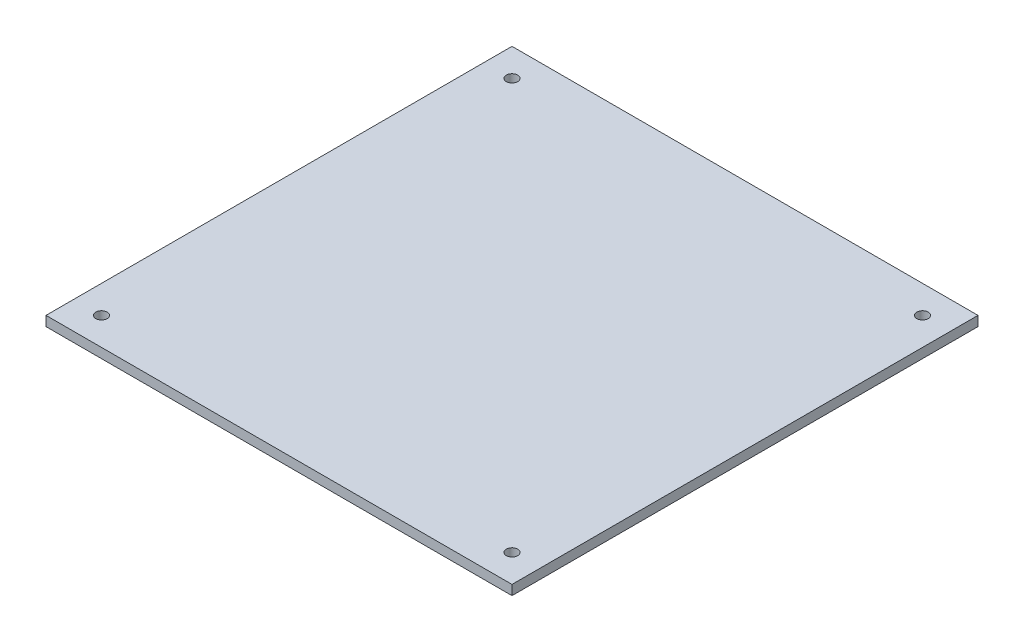
ISO-10303-21;
HEADER;
FILE_DESCRIPTION(('STEP AP214'),'2;1');
FILE_NAME('part.step','',(''),(''),'','','');
FILE_SCHEMA(('AUTOMOTIVE_DESIGN { 1 0 10303 214 1 1 1 1 }'));
ENDSEC;
DATA;
#1=APPLICATION_CONTEXT('core data for automotive mechanical design processes');
#2=APPLICATION_PROTOCOL_DEFINITION('international standard','automotive_design',2000,#1);
#3=PRODUCT_CONTEXT('',#1,'mechanical');
#4=PRODUCT('Part','Part','',(#3));
#5=PRODUCT_RELATED_PRODUCT_CATEGORY('part','',(#4));
#6=PRODUCT_DEFINITION_FORMATION('','',#4);
#7=PRODUCT_DEFINITION_CONTEXT('part definition',#1,'design');
#8=PRODUCT_DEFINITION('design','',#6,#7);
#9=PRODUCT_DEFINITION_SHAPE('','',#8);
#10=(LENGTH_UNIT() NAMED_UNIT(*) SI_UNIT(.MILLI.,.METRE.));
#11=(NAMED_UNIT(*) PLANE_ANGLE_UNIT() SI_UNIT($,.RADIAN.));
#12=(NAMED_UNIT(*) SI_UNIT($,.STERADIAN.) SOLID_ANGLE_UNIT());
#13=UNCERTAINTY_MEASURE_WITH_UNIT(LENGTH_MEASURE(1.E-05),#10,'distance_accuracy_value','');
#14=(GEOMETRIC_REPRESENTATION_CONTEXT(3) GLOBAL_UNCERTAINTY_ASSIGNED_CONTEXT((#13)) GLOBAL_UNIT_ASSIGNED_CONTEXT((#10,
#11,#12)) REPRESENTATION_CONTEXT('',''));
#15=CARTESIAN_POINT('',(0.,0.,0.));
#16=DIRECTION('',(0.,0.,1.));
#17=DIRECTION('',(1.,0.,0.));
#18=AXIS2_PLACEMENT_3D('',#15,#16,#17);
#19=CARTESIAN_POINT('',(0.,5.588,0.));
#20=DIRECTION('',(0.,-1.,0.));
#21=DIRECTION('',(0.,0.,-1.));
#22=AXIS2_PLACEMENT_3D('',#19,#20,#21);
#23=PLANE('',#22);
#24=DIRECTION('',(0.,0.,1.));
#25=VECTOR('',#24,1.);
#26=CARTESIAN_POINT('',(0.,5.588,0.));
#27=LINE('',#26,#25);
#28=CARTESIAN_POINT('',(0.,5.588,-266.7));
#29=VERTEX_POINT('',#28);
#30=CARTESIAN_POINT('',(0.,5.588,0.));
#31=VERTEX_POINT('',#30);
#32=EDGE_CURVE('E85',#29,#31,#27,.T.);
#33=ORIENTED_EDGE('',*,*,#32,.T.);
#34=DIRECTION('',(1.,0.,0.));
#35=VECTOR('',#34,1.);
#36=CARTESIAN_POINT('',(0.,5.588,0.));
#37=LINE('',#36,#35);
#38=CARTESIAN_POINT('',(266.7,5.588,0.));
#39=VERTEX_POINT('',#38);
#40=EDGE_CURVE('E80',#31,#39,#37,.T.);
#41=ORIENTED_EDGE('',*,*,#40,.T.);
#42=DIRECTION('',(0.,0.,-1.));
#43=VECTOR('',#42,1.);
#44=CARTESIAN_POINT('',(266.7,5.588,0.));
#45=LINE('',#44,#43);
#46=CARTESIAN_POINT('',(266.7,5.588,-266.7));
#47=VERTEX_POINT('',#46);
#48=EDGE_CURVE('E83',#39,#47,#45,.T.);
#49=ORIENTED_EDGE('',*,*,#48,.T.);
#50=DIRECTION('',(-1.,0.,0.));
#51=VECTOR('',#50,1.);
#52=CARTESIAN_POINT('',(0.,5.588,-266.7));
#53=LINE('',#52,#51);
#54=EDGE_CURVE('E50',#47,#29,#53,.T.);
#55=ORIENTED_EDGE('',*,*,#54,.T.);
#56=EDGE_LOOP('',(#33,#41,#49,#55));
#57=FACE_BOUND('',#56,.T.);
#58=CARTESIAN_POINT('',(15.875,5.588,-250.825));
#59=DIRECTION('',(0.,1.,0.));
#60=DIRECTION('',(0.,0.,1.));
#61=AXIS2_PLACEMENT_3D('',#58,#59,#60);
#62=CIRCLE('',#61,3.26390000000001);
#63=CARTESIAN_POINT('',(15.875,5.588,-247.5611));
#64=VERTEX_POINT('',#63);
#65=EDGE_CURVE('E100',#64,#64,#62,.T.);
#66=ORIENTED_EDGE('',*,*,#65,.F.);
#67=EDGE_LOOP('',(#66));
#68=FACE_BOUND('',#67,.T.);
#69=CARTESIAN_POINT('',(250.825,5.588,-250.825));
#70=DIRECTION('',(0.,1.,0.));
#71=DIRECTION('',(0.,0.,1.));
#72=AXIS2_PLACEMENT_3D('',#69,#70,#71);
#73=CIRCLE('',#72,3.26390000000001);
#74=CARTESIAN_POINT('',(250.825,5.588,-247.5611));
#75=VERTEX_POINT('',#74);
#76=EDGE_CURVE('E115',#75,#75,#73,.T.);
#77=ORIENTED_EDGE('',*,*,#76,.F.);
#78=EDGE_LOOP('',(#77));
#79=FACE_BOUND('',#78,.T.);
#80=CARTESIAN_POINT('',(15.875,5.588,-15.875));
#81=DIRECTION('',(0.,1.,0.));
#82=DIRECTION('',(0.,0.,1.));
#83=AXIS2_PLACEMENT_3D('',#80,#81,#82);
#84=CIRCLE('',#83,3.2639);
#85=CARTESIAN_POINT('',(15.875,5.588,-12.6111));
#86=VERTEX_POINT('',#85);
#87=EDGE_CURVE('E121',#86,#86,#84,.T.);
#88=ORIENTED_EDGE('',*,*,#87,.F.);
#89=EDGE_LOOP('',(#88));
#90=FACE_BOUND('',#89,.T.);
#91=CARTESIAN_POINT('',(250.825,5.588,-15.875));
#92=DIRECTION('',(0.,1.,0.));
#93=DIRECTION('',(0.,0.,1.));
#94=AXIS2_PLACEMENT_3D('',#91,#92,#93);
#95=CIRCLE('',#94,3.26390000000001);
#96=CARTESIAN_POINT('',(250.825,5.588,-12.6111));
#97=VERTEX_POINT('',#96);
#98=EDGE_CURVE('E127',#97,#97,#95,.T.);
#99=ORIENTED_EDGE('',*,*,#98,.F.);
#100=EDGE_LOOP('',(#99));
#101=FACE_BOUND('',#100,.T.);
#102=ADVANCED_FACE('F33',(#57,#68,#79,#90,#101),#23,.F.);
#103=CARTESIAN_POINT('',(0.,0.,0.));
#104=DIRECTION('',(0.,-1.,0.));
#105=DIRECTION('',(0.,0.,-1.));
#106=AXIS2_PLACEMENT_3D('',#103,#104,#105);
#107=PLANE('',#106);
#108=CARTESIAN_POINT('',(15.875,0.,-15.875));
#109=DIRECTION('',(0.,1.,0.));
#110=DIRECTION('',(0.,0.,1.));
#111=AXIS2_PLACEMENT_3D('',#108,#109,#110);
#112=CIRCLE('',#111,3.2639);
#113=CARTESIAN_POINT('',(15.875,0.,-12.6111));
#114=VERTEX_POINT('',#113);
#115=EDGE_CURVE('E124',#114,#114,#112,.T.);
#116=ORIENTED_EDGE('',*,*,#115,.T.);
#117=EDGE_LOOP('',(#116));
#118=FACE_BOUND('',#117,.T.);
#119=CARTESIAN_POINT('',(15.875,0.,-250.825));
#120=DIRECTION('',(0.,1.,0.));
#121=DIRECTION('',(0.,0.,1.));
#122=AXIS2_PLACEMENT_3D('',#119,#120,#121);
#123=CIRCLE('',#122,3.26390000000001);
#124=CARTESIAN_POINT('',(15.875,0.,-247.5611));
#125=VERTEX_POINT('',#124);
#126=EDGE_CURVE('E112',#125,#125,#123,.T.);
#127=ORIENTED_EDGE('',*,*,#126,.T.);
#128=EDGE_LOOP('',(#127));
#129=FACE_BOUND('',#128,.T.);
#130=DIRECTION('',(0.,0.,1.));
#131=VECTOR('',#130,1.);
#132=CARTESIAN_POINT('',(0.,0.,0.));
#133=LINE('',#132,#131);
#134=CARTESIAN_POINT('',(0.,0.,-266.7));
#135=VERTEX_POINT('',#134);
#136=CARTESIAN_POINT('',(0.,0.,0.));
#137=VERTEX_POINT('',#136);
#138=EDGE_CURVE('E97',#135,#137,#133,.T.);
#139=ORIENTED_EDGE('',*,*,#138,.F.);
#140=DIRECTION('',(-1.,0.,0.));
#141=VECTOR('',#140,1.);
#142=CARTESIAN_POINT('',(0.,0.,-266.7));
#143=LINE('',#142,#141);
#144=CARTESIAN_POINT('',(266.7,0.,-266.7));
#145=VERTEX_POINT('',#144);
#146=EDGE_CURVE('E73',#145,#135,#143,.T.);
#147=ORIENTED_EDGE('',*,*,#146,.F.);
#148=DIRECTION('',(0.,0.,-1.));
#149=VECTOR('',#148,1.);
#150=CARTESIAN_POINT('',(266.7,0.,0.));
#151=LINE('',#150,#149);
#152=CARTESIAN_POINT('',(266.7,0.,0.));
#153=VERTEX_POINT('',#152);
#154=EDGE_CURVE('E67',#153,#145,#151,.T.);
#155=ORIENTED_EDGE('',*,*,#154,.F.);
#156=DIRECTION('',(1.,0.,0.));
#157=VECTOR('',#156,1.);
#158=CARTESIAN_POINT('',(0.,0.,0.));
#159=LINE('',#158,#157);
#160=EDGE_CURVE('E89',#137,#153,#159,.T.);
#161=ORIENTED_EDGE('',*,*,#160,.F.);
#162=EDGE_LOOP('',(#139,#147,#155,#161));
#163=FACE_BOUND('',#162,.T.);
#164=CARTESIAN_POINT('',(250.825,0.,-250.825));
#165=DIRECTION('',(0.,1.,0.));
#166=DIRECTION('',(0.,0.,1.));
#167=AXIS2_PLACEMENT_3D('',#164,#165,#166);
#168=CIRCLE('',#167,3.26390000000001);
#169=CARTESIAN_POINT('',(250.825,0.,-247.5611));
#170=VERTEX_POINT('',#169);
#171=EDGE_CURVE('E118',#170,#170,#168,.T.);
#172=ORIENTED_EDGE('',*,*,#171,.T.);
#173=EDGE_LOOP('',(#172));
#174=FACE_BOUND('',#173,.T.);
#175=CARTESIAN_POINT('',(250.825,0.,-15.875));
#176=DIRECTION('',(0.,1.,0.));
#177=DIRECTION('',(0.,0.,1.));
#178=AXIS2_PLACEMENT_3D('',#175,#176,#177);
#179=CIRCLE('',#178,3.26390000000001);
#180=CARTESIAN_POINT('',(250.825,0.,-12.6111));
#181=VERTEX_POINT('',#180);
#182=EDGE_CURVE('E130',#181,#181,#179,.T.);
#183=ORIENTED_EDGE('',*,*,#182,.T.);
#184=EDGE_LOOP('',(#183));
#185=FACE_BOUND('',#184,.T.);
#186=ADVANCED_FACE('F108',(#118,#129,#163,#174,#185),#107,.T.);
#187=CARTESIAN_POINT('',(0.,5.588,0.));
#188=DIRECTION('',(1.,0.,0.));
#189=DIRECTION('',(0.,0.,-1.));
#190=AXIS2_PLACEMENT_3D('',#187,#188,#189);
#191=PLANE('',#190);
#192=ORIENTED_EDGE('',*,*,#138,.T.);
#193=DIRECTION('',(0.,-1.,0.));
#194=VECTOR('',#193,1.);
#195=CARTESIAN_POINT('',(0.,5.588,0.));
#196=LINE('',#195,#194);
#197=EDGE_CURVE('E11',#31,#137,#196,.T.);
#198=ORIENTED_EDGE('',*,*,#197,.F.);
#199=ORIENTED_EDGE('',*,*,#32,.F.);
#200=DIRECTION('',(0.,-1.,0.));
#201=VECTOR('',#200,1.);
#202=CARTESIAN_POINT('',(0.,5.588,-266.7));
#203=LINE('',#202,#201);
#204=EDGE_CURVE('E93',#29,#135,#203,.T.);
#205=ORIENTED_EDGE('',*,*,#204,.T.);
#206=EDGE_LOOP('',(#192,#198,#199,#205));
#207=FACE_BOUND('',#206,.T.);
#208=ADVANCED_FACE('F35',(#207),#191,.F.);
#209=CARTESIAN_POINT('',(0.,5.588,0.));
#210=DIRECTION('',(0.,0.,-1.));
#211=DIRECTION('',(-1.,0.,0.));
#212=AXIS2_PLACEMENT_3D('',#209,#210,#211);
#213=PLANE('',#212);
#214=ORIENTED_EDGE('',*,*,#160,.T.);
#215=DIRECTION('',(0.,-1.,0.));
#216=VECTOR('',#215,1.);
#217=CARTESIAN_POINT('',(266.7,5.588,0.));
#218=LINE('',#217,#216);
#219=EDGE_CURVE('E42',#39,#153,#218,.T.);
#220=ORIENTED_EDGE('',*,*,#219,.F.);
#221=ORIENTED_EDGE('',*,*,#40,.F.);
#222=ORIENTED_EDGE('',*,*,#197,.T.);
#223=EDGE_LOOP('',(#214,#220,#221,#222));
#224=FACE_BOUND('',#223,.T.);
#225=ADVANCED_FACE('F88',(#224),#213,.F.);
#226=CARTESIAN_POINT('',(266.7,5.588,0.));
#227=DIRECTION('',(-1.,0.,0.));
#228=DIRECTION('',(0.,0.,1.));
#229=AXIS2_PLACEMENT_3D('',#226,#227,#228);
#230=PLANE('',#229);
#231=ORIENTED_EDGE('',*,*,#154,.T.);
#232=DIRECTION('',(0.,-1.,0.));
#233=VECTOR('',#232,1.);
#234=CARTESIAN_POINT('',(266.7,5.588,-266.7));
#235=LINE('',#234,#233);
#236=EDGE_CURVE('E90',#47,#145,#235,.T.);
#237=ORIENTED_EDGE('',*,*,#236,.F.);
#238=ORIENTED_EDGE('',*,*,#48,.F.);
#239=ORIENTED_EDGE('',*,*,#219,.T.);
#240=EDGE_LOOP('',(#231,#237,#238,#239));
#241=FACE_BOUND('',#240,.T.);
#242=ADVANCED_FACE('F91',(#241),#230,.F.);
#243=CARTESIAN_POINT('',(0.,5.588,-266.7));
#244=DIRECTION('',(0.,0.,1.));
#245=DIRECTION('',(1.,0.,0.));
#246=AXIS2_PLACEMENT_3D('',#243,#244,#245);
#247=PLANE('',#246);
#248=ORIENTED_EDGE('',*,*,#146,.T.);
#249=ORIENTED_EDGE('',*,*,#204,.F.);
#250=ORIENTED_EDGE('',*,*,#54,.F.);
#251=ORIENTED_EDGE('',*,*,#236,.T.);
#252=EDGE_LOOP('',(#248,#249,#250,#251));
#253=FACE_BOUND('',#252,.T.);
#254=ADVANCED_FACE('F105',(#253),#247,.F.);
#255=CARTESIAN_POINT('',(15.875,5.588,-250.825));
#256=DIRECTION('',(0.,-1.,0.));
#257=DIRECTION('',(0.,0.,-1.));
#258=AXIS2_PLACEMENT_3D('',#255,#256,#257);
#259=CYLINDRICAL_SURFACE('',#258,3.26390000000001);
#260=ORIENTED_EDGE('',*,*,#65,.T.);
#261=EDGE_LOOP('',(#260));
#262=FACE_BOUND('',#261,.T.);
#263=ORIENTED_EDGE('',*,*,#126,.F.);
#264=EDGE_LOOP('',(#263));
#265=FACE_BOUND('',#264,.T.);
#266=ADVANCED_FACE('F147',(#262,#265),#259,.F.);
#267=CARTESIAN_POINT('',(250.825,5.588,-250.825));
#268=DIRECTION('',(0.,-1.,0.));
#269=DIRECTION('',(0.,0.,-1.));
#270=AXIS2_PLACEMENT_3D('',#267,#268,#269);
#271=CYLINDRICAL_SURFACE('',#270,3.26390000000001);
#272=ORIENTED_EDGE('',*,*,#76,.T.);
#273=EDGE_LOOP('',(#272));
#274=FACE_BOUND('',#273,.T.);
#275=ORIENTED_EDGE('',*,*,#171,.F.);
#276=EDGE_LOOP('',(#275));
#277=FACE_BOUND('',#276,.T.);
#278=ADVANCED_FACE('F193',(#274,#277),#271,.F.);
#279=CARTESIAN_POINT('',(15.875,5.588,-15.875));
#280=DIRECTION('',(0.,-1.,0.));
#281=DIRECTION('',(0.,0.,-1.));
#282=AXIS2_PLACEMENT_3D('',#279,#280,#281);
#283=CYLINDRICAL_SURFACE('',#282,3.2639);
#284=ORIENTED_EDGE('',*,*,#87,.T.);
#285=EDGE_LOOP('',(#284));
#286=FACE_BOUND('',#285,.T.);
#287=ORIENTED_EDGE('',*,*,#115,.F.);
#288=EDGE_LOOP('',(#287));
#289=FACE_BOUND('',#288,.T.);
#290=ADVANCED_FACE('F201',(#286,#289),#283,.F.);
#291=CARTESIAN_POINT('',(250.825,5.588,-15.875));
#292=DIRECTION('',(0.,-1.,0.));
#293=DIRECTION('',(0.,0.,-1.));
#294=AXIS2_PLACEMENT_3D('',#291,#292,#293);
#295=CYLINDRICAL_SURFACE('',#294,3.26390000000001);
#296=ORIENTED_EDGE('',*,*,#98,.T.);
#297=EDGE_LOOP('',(#296));
#298=FACE_BOUND('',#297,.T.);
#299=ORIENTED_EDGE('',*,*,#182,.F.);
#300=EDGE_LOOP('',(#299));
#301=FACE_BOUND('',#300,.T.);
#302=ADVANCED_FACE('F136',(#298,#301),#295,.F.);
#303=CLOSED_SHELL('',(#102,#186,#208,#225,#242,#254,#266,#278,#290,#302));
#304=MANIFOLD_SOLID_BREP('B2',#303);
#305=ADVANCED_BREP_SHAPE_REPRESENTATION('',(#18,#304),#14);
#306=SHAPE_DEFINITION_REPRESENTATION(#9,#305);
ENDSEC;
END-ISO-10303-21;
